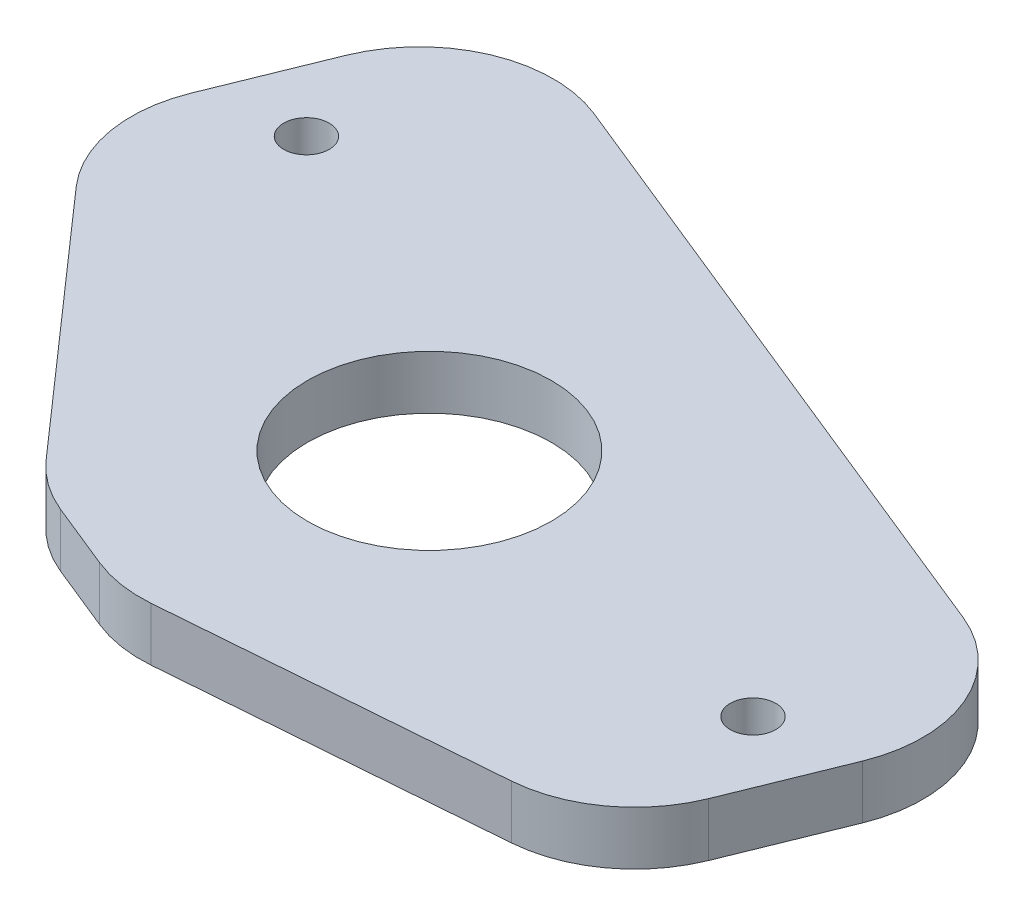
ISO-10303-21;
HEADER;
FILE_DESCRIPTION(('STEP AP214'),'2;1');
FILE_NAME('part.step','',(''),(''),'','','');
FILE_SCHEMA(('AUTOMOTIVE_DESIGN { 1 0 10303 214 1 1 1 1 }'));
ENDSEC;
DATA;
#1=APPLICATION_CONTEXT('core data for automotive mechanical design processes');
#2=APPLICATION_PROTOCOL_DEFINITION('international standard','automotive_design',2000,#1);
#3=PRODUCT_CONTEXT('',#1,'mechanical');
#4=PRODUCT('Part','Part','',(#3));
#5=PRODUCT_RELATED_PRODUCT_CATEGORY('part','',(#4));
#6=PRODUCT_DEFINITION_FORMATION('','',#4);
#7=PRODUCT_DEFINITION_CONTEXT('part definition',#1,'design');
#8=PRODUCT_DEFINITION('design','',#6,#7);
#9=PRODUCT_DEFINITION_SHAPE('','',#8);
#10=(LENGTH_UNIT() NAMED_UNIT(*) SI_UNIT(.MILLI.,.METRE.));
#11=(NAMED_UNIT(*) PLANE_ANGLE_UNIT() SI_UNIT($,.RADIAN.));
#12=(NAMED_UNIT(*) SI_UNIT($,.STERADIAN.) SOLID_ANGLE_UNIT());
#13=UNCERTAINTY_MEASURE_WITH_UNIT(LENGTH_MEASURE(1.E-05),#10,'distance_accuracy_value','');
#14=(GEOMETRIC_REPRESENTATION_CONTEXT(3) GLOBAL_UNCERTAINTY_ASSIGNED_CONTEXT((#13)) GLOBAL_UNIT_ASSIGNED_CONTEXT((#10,
#11,#12)) REPRESENTATION_CONTEXT('',''));
#15=CARTESIAN_POINT('',(0.,0.,0.));
#16=DIRECTION('',(0.,0.,1.));
#17=DIRECTION('',(1.,0.,0.));
#18=AXIS2_PLACEMENT_3D('',#15,#16,#17);
#19=CARTESIAN_POINT('',(0.,4.,0.));
#20=DIRECTION('',(0.,1.,0.));
#21=DIRECTION('',(0.,0.,1.));
#22=AXIS2_PLACEMENT_3D('',#19,#20,#21);
#23=PLANE('',#22);
#24=DIRECTION('',(0.375759041788815,0.,-0.926717401646236));
#25=VECTOR('',#24,1.);
#26=CARTESIAN_POINT('',(-141.27076053019,4.,-1.05980639931145));
#27=LINE('',#26,#25);
#28=CARTESIAN_POINT('',(-133.312056309301,4.,-20.6879959458386));
#29=VERTEX_POINT('',#28);
#30=CARTESIAN_POINT('',(-129.997989276525,4.,-28.8613284486986));
#31=VERTEX_POINT('',#30);
#32=EDGE_CURVE('E163',#29,#31,#27,.T.);
#33=ORIENTED_EDGE('',*,*,#32,.T.);
#34=CARTESIAN_POINT('',(-139.265163292987,4.,-32.6189188665867));
#35=DIRECTION('',(0.,1.,0.));
#36=DIRECTION('',(0.,0.,1.));
#37=AXIS2_PLACEMENT_3D('',#34,#35,#36);
#38=CIRCLE('',#37,10.);
#39=CARTESIAN_POINT('',(-135.507572875099,4.,-41.8860928830491));
#40=VERTEX_POINT('',#39);
#41=EDGE_CURVE('E184',#31,#40,#38,.T.);
#42=ORIENTED_EDGE('',*,*,#41,.T.);
#43=DIRECTION('',(-0.926717401646236,0.,-0.375759041788815));
#44=VECTOR('',#43,1.);
#45=CARTESIAN_POINT('',(-126.240398858637,4.,-38.1285024651609));
#46=LINE('',#45,#44);
#47=CARTESIAN_POINT('',(-181.843442957411,4.,-60.6740449724898));
#48=VERTEX_POINT('',#47);
#49=EDGE_CURVE('E144',#40,#48,#46,.T.);
#50=ORIENTED_EDGE('',*,*,#49,.T.);
#51=CARTESIAN_POINT('',(-185.601033375299,4.,-51.4068709560275));
#52=DIRECTION('',(0.,1.,0.));
#53=DIRECTION('',(0.,0.,1.));
#54=AXIS2_PLACEMENT_3D('',#51,#52,#53);
#55=CIRCLE('',#54,10.);
#56=CARTESIAN_POINT('',(-194.868207391762,4.,-55.1644613739156));
#57=VERTEX_POINT('',#56);
#58=EDGE_CURVE('E182',#48,#57,#55,.T.);
#59=ORIENTED_EDGE('',*,*,#58,.T.);
#60=DIRECTION('',(-0.375759041788815,0.,0.926717401646236));
#61=VECTOR('',#60,1.);
#62=CARTESIAN_POINT('',(-191.110616973873,4.,-64.431635390378));
#63=LINE('',#62,#61);
#64=CARTESIAN_POINT('',(-198.182274424538,4.,-46.9911288710557));
#65=VERTEX_POINT('',#64);
#66=EDGE_CURVE('E243',#57,#65,#63,.T.);
#67=ORIENTED_EDGE('',*,*,#66,.T.);
#68=CARTESIAN_POINT('',(-188.915100408076,4.,-43.2335384531675));
#69=DIRECTION('',(0.,1.,0.));
#70=DIRECTION('',(0.,0.,1.));
#71=AXIS2_PLACEMENT_3D('',#68,#69,#70);
#72=CIRCLE('',#71,10.);
#73=CARTESIAN_POINT('',(-196.420397662501,4.,-36.6251715503156));
#74=VERTEX_POINT('',#73);
#75=EDGE_CURVE('E180',#65,#74,#72,.T.);
#76=ORIENTED_EDGE('',*,*,#75,.T.);
#77=DIRECTION('',(-0.660836690285189,0.,-0.750529725442582));
#78=VECTOR('',#77,1.);
#79=CARTESIAN_POINT('',(-200.504593018594,4.,-41.263700349222));
#80=LINE('',#79,#78);
#81=CARTESIAN_POINT('',(-179.899480405372,4.,-17.8619284142511));
#82=VERTEX_POINT('',#81);
#83=EDGE_CURVE('E220',#82,#74,#80,.T.);
#84=ORIENTED_EDGE('',*,*,#83,.F.);
#85=CARTESIAN_POINT('',(-172.394183150946,4.,-24.470295317103));
#86=DIRECTION('',(0.,1.,0.));
#87=DIRECTION('',(0.,0.,1.));
#88=AXIS2_PLACEMENT_3D('',#85,#86,#87);
#89=CIRCLE('',#88,10.);
#90=CARTESIAN_POINT('',(-176.151773568834,4.,-15.2031213006406));
#91=VERTEX_POINT('',#90);
#92=EDGE_CURVE('E57',#82,#91,#89,.T.);
#93=ORIENTED_EDGE('',*,*,#92,.T.);
#94=DIRECTION('',(0.926717401646236,0.,0.375759041788815));
#95=VECTOR('',#94,1.);
#96=CARTESIAN_POINT('',(-206.140978645426,4.,-27.3629393245285));
#97=LINE('',#96,#95);
#98=CARTESIAN_POINT('',(-171.259965606781,4.,-13.2196244231994));
#99=VERTEX_POINT('',#98);
#100=EDGE_CURVE('E164',#91,#99,#97,.T.);
#101=ORIENTED_EDGE('',*,*,#100,.T.);
#102=CARTESIAN_POINT('',(-167.502375188893,4.,-22.4867984396617));
#103=DIRECTION('',(0.,1.,0.));
#104=DIRECTION('',(0.,0.,1.));
#105=AXIS2_PLACEMENT_3D('',#102,#103,#104);
#106=CIRCLE('',#105,10.);
#107=CARTESIAN_POINT('',(-166.718860019267,4.,-12.5175404944099));
#108=VERTEX_POINT('',#107);
#109=EDGE_CURVE('E49',#99,#108,#106,.T.);
#110=ORIENTED_EDGE('',*,*,#109,.T.);
#111=DIRECTION('',(-0.996925794525179,0.,0.078351516962602));
#112=VECTOR('',#111,1.);
#113=CARTESIAN_POINT('',(-135.634374903357,4.,-14.960567424005));
#114=LINE('',#113,#112);
#115=CARTESIAN_POINT('',(-141.795715156138,4.,-14.476328418475));
#116=VERTEX_POINT('',#115);
#117=EDGE_CURVE('E207',#116,#108,#114,.T.);
#118=ORIENTED_EDGE('',*,*,#117,.F.);
#119=CARTESIAN_POINT('',(-142.579230325764,4.,-24.4455863637268));
#120=DIRECTION('',(0.,1.,0.));
#121=DIRECTION('',(0.,0.,1.));
#122=AXIS2_PLACEMENT_3D('',#119,#120,#121);
#123=CIRCLE('',#122,10.);
#124=EDGE_CURVE('E176',#116,#29,#123,.T.);
#125=ORIENTED_EDGE('',*,*,#124,.T.);
#126=EDGE_LOOP('',(#33,#42,#50,#59,#67,#76,#84,#93,#101,#110,#118,#125));
#127=FACE_BOUND('',#126,.T.);
#128=CARTESIAN_POINT('',(-191.102800778534,4.,-48.4832324797371));
#129=DIRECTION('',(0.,1.,0.));
#130=DIRECTION('',(0.,0.,1.));
#131=AXIS2_PLACEMENT_3D('',#128,#129,#130);
#132=CIRCLE('',#131,1.70000000000001);
#133=CARTESIAN_POINT('',(-191.102800778534,4.,-46.7832324797371));
#134=VERTEX_POINT('',#133);
#135=EDGE_CURVE('E231',#134,#134,#132,.T.);
#136=ORIENTED_EDGE('',*,*,#135,.F.);
#137=EDGE_LOOP('',(#136));
#138=FACE_BOUND('',#137,.T.);
#139=CARTESIAN_POINT('',(-136.96169642471,4.,-27.6547344781782));
#140=DIRECTION('',(0.,1.,0.));
#141=DIRECTION('',(0.,0.,1.));
#142=AXIS2_PLACEMENT_3D('',#139,#140,#141);
#143=CIRCLE('',#142,1.69999999999998);
#144=CARTESIAN_POINT('',(-136.96169642471,4.,-25.9547344781782));
#145=VERTEX_POINT('',#144);
#146=EDGE_CURVE('E157',#145,#145,#143,.T.);
#147=ORIENTED_EDGE('',*,*,#146,.F.);
#148=EDGE_LOOP('',(#147));
#149=FACE_BOUND('',#148,.T.);
#150=CARTESIAN_POINT('',(-166.190688752031,4.,-32.7457208948447));
#151=DIRECTION('',(0.,1.,0.));
#152=DIRECTION('',(0.,0.,1.));
#153=AXIS2_PLACEMENT_3D('',#150,#151,#152);
#154=CIRCLE('',#153,9.1);
#155=CARTESIAN_POINT('',(-166.190688752031,4.,-23.6457208948447));
#156=VERTEX_POINT('',#155);
#157=EDGE_CURVE('E225',#156,#156,#154,.T.);
#158=ORIENTED_EDGE('',*,*,#157,.F.);
#159=EDGE_LOOP('',(#158));
#160=FACE_BOUND('',#159,.T.);
#161=ADVANCED_FACE('F34',(#127,#138,#149,#160),#23,.T.);
#162=CARTESIAN_POINT('',(0.,0.,0.));
#163=DIRECTION('',(0.,1.,0.));
#164=DIRECTION('',(0.,0.,1.));
#165=AXIS2_PLACEMENT_3D('',#162,#163,#164);
#166=PLANE('',#165);
#167=DIRECTION('',(-0.926717401646236,0.,-0.375759041788815));
#168=VECTOR('',#167,1.);
#169=CARTESIAN_POINT('',(-126.240398858637,0.,-38.1285024651609));
#170=LINE('',#169,#168);
#171=CARTESIAN_POINT('',(-135.507572875099,0.,-41.8860928830491));
#172=VERTEX_POINT('',#171);
#173=CARTESIAN_POINT('',(-181.843442957411,0.,-60.6740449724898));
#174=VERTEX_POINT('',#173);
#175=EDGE_CURVE('E141',#172,#174,#170,.T.);
#176=ORIENTED_EDGE('',*,*,#175,.F.);
#177=CARTESIAN_POINT('',(-139.265163292987,0.,-32.6189188665867));
#178=DIRECTION('',(0.,1.,0.));
#179=DIRECTION('',(0.,0.,1.));
#180=AXIS2_PLACEMENT_3D('',#177,#178,#179);
#181=CIRCLE('',#180,10.);
#182=CARTESIAN_POINT('',(-129.997989276525,0.,-28.8613284486986));
#183=VERTEX_POINT('',#182);
#184=EDGE_CURVE('E124',#172,#183,#181,.F.);
#185=ORIENTED_EDGE('',*,*,#184,.T.);
#186=DIRECTION('',(0.375759041788815,0.,-0.926717401646236));
#187=VECTOR('',#186,1.);
#188=CARTESIAN_POINT('',(-141.27076053019,0.,-1.05980639931145));
#189=LINE('',#188,#187);
#190=CARTESIAN_POINT('',(-133.312056309301,0.,-20.6879959458386));
#191=VERTEX_POINT('',#190);
#192=EDGE_CURVE('E152',#191,#183,#189,.T.);
#193=ORIENTED_EDGE('',*,*,#192,.F.);
#194=CARTESIAN_POINT('',(-142.579230325764,0.,-24.4455863637268));
#195=DIRECTION('',(0.,1.,0.));
#196=DIRECTION('',(0.,0.,1.));
#197=AXIS2_PLACEMENT_3D('',#194,#195,#196);
#198=CIRCLE('',#197,10.);
#199=CARTESIAN_POINT('',(-141.795715156138,0.,-14.476328418475));
#200=VERTEX_POINT('',#199);
#201=EDGE_CURVE('E145',#191,#200,#198,.F.);
#202=ORIENTED_EDGE('',*,*,#201,.T.);
#203=DIRECTION('',(-0.996925794525179,0.,0.078351516962602));
#204=VECTOR('',#203,1.);
#205=CARTESIAN_POINT('',(-135.634374903357,0.,-14.960567424005));
#206=LINE('',#205,#204);
#207=CARTESIAN_POINT('',(-166.718860019267,0.,-12.5175404944099));
#208=VERTEX_POINT('',#207);
#209=EDGE_CURVE('E209',#200,#208,#206,.T.);
#210=ORIENTED_EDGE('',*,*,#209,.T.);
#211=CARTESIAN_POINT('',(-167.502375188893,0.,-22.4867984396617));
#212=DIRECTION('',(0.,1.,0.));
#213=DIRECTION('',(0.,0.,1.));
#214=AXIS2_PLACEMENT_3D('',#211,#212,#213);
#215=CIRCLE('',#214,10.);
#216=CARTESIAN_POINT('',(-171.259965606781,0.,-13.2196244231994));
#217=VERTEX_POINT('',#216);
#218=EDGE_CURVE('E167',#208,#217,#215,.F.);
#219=ORIENTED_EDGE('',*,*,#218,.T.);
#220=DIRECTION('',(0.926717401646236,0.,0.375759041788815));
#221=VECTOR('',#220,1.);
#222=CARTESIAN_POINT('',(-206.140978645426,0.,-27.3629393245285));
#223=LINE('',#222,#221);
#224=CARTESIAN_POINT('',(-176.151773568834,0.,-15.2031213006406));
#225=VERTEX_POINT('',#224);
#226=EDGE_CURVE('E155',#225,#217,#223,.T.);
#227=ORIENTED_EDGE('',*,*,#226,.F.);
#228=CARTESIAN_POINT('',(-172.394183150946,0.,-24.470295317103));
#229=DIRECTION('',(0.,1.,0.));
#230=DIRECTION('',(0.,0.,1.));
#231=AXIS2_PLACEMENT_3D('',#228,#229,#230);
#232=CIRCLE('',#231,10.);
#233=CARTESIAN_POINT('',(-179.899480405372,0.,-17.8619284142511));
#234=VERTEX_POINT('',#233);
#235=EDGE_CURVE('E169',#225,#234,#232,.F.);
#236=ORIENTED_EDGE('',*,*,#235,.T.);
#237=DIRECTION('',(-0.660836690285189,0.,-0.750529725442582));
#238=VECTOR('',#237,1.);
#239=CARTESIAN_POINT('',(-200.504593018594,0.,-41.263700349222));
#240=LINE('',#239,#238);
#241=CARTESIAN_POINT('',(-196.420397662501,0.,-36.6251715503156));
#242=VERTEX_POINT('',#241);
#243=EDGE_CURVE('E215',#234,#242,#240,.T.);
#244=ORIENTED_EDGE('',*,*,#243,.T.);
#245=CARTESIAN_POINT('',(-188.915100408076,0.,-43.2335384531675));
#246=DIRECTION('',(0.,1.,0.));
#247=DIRECTION('',(0.,0.,1.));
#248=AXIS2_PLACEMENT_3D('',#245,#246,#247);
#249=CIRCLE('',#248,10.);
#250=CARTESIAN_POINT('',(-198.182274424538,0.,-46.9911288710557));
#251=VERTEX_POINT('',#250);
#252=EDGE_CURVE('E171',#242,#251,#249,.F.);
#253=ORIENTED_EDGE('',*,*,#252,.T.);
#254=DIRECTION('',(-0.375759041788815,0.,0.926717401646236));
#255=VECTOR('',#254,1.);
#256=CARTESIAN_POINT('',(-191.110616973873,0.,-64.431635390378));
#257=LINE('',#256,#255);
#258=CARTESIAN_POINT('',(-194.868207391762,0.,-55.1644613739156));
#259=VERTEX_POINT('',#258);
#260=EDGE_CURVE('E151',#259,#251,#257,.T.);
#261=ORIENTED_EDGE('',*,*,#260,.F.);
#262=CARTESIAN_POINT('',(-185.601033375299,0.,-51.4068709560275));
#263=DIRECTION('',(0.,1.,0.));
#264=DIRECTION('',(0.,0.,1.));
#265=AXIS2_PLACEMENT_3D('',#262,#263,#264);
#266=CIRCLE('',#265,10.);
#267=EDGE_CURVE('E135',#259,#174,#266,.F.);
#268=ORIENTED_EDGE('',*,*,#267,.T.);
#269=EDGE_LOOP('',(#176,#185,#193,#202,#210,#219,#227,#236,#244,#253,#261,#268));
#270=FACE_BOUND('',#269,.T.);
#271=CARTESIAN_POINT('',(-136.96169642471,0.,-27.6547344781782));
#272=DIRECTION('',(0.,1.,0.));
#273=DIRECTION('',(0.,0.,1.));
#274=AXIS2_PLACEMENT_3D('',#271,#272,#273);
#275=CIRCLE('',#274,1.69999999999998);
#276=CARTESIAN_POINT('',(-136.96169642471,0.,-25.9547344781782));
#277=VERTEX_POINT('',#276);
#278=EDGE_CURVE('E234',#277,#277,#275,.T.);
#279=ORIENTED_EDGE('',*,*,#278,.T.);
#280=EDGE_LOOP('',(#279));
#281=FACE_BOUND('',#280,.T.);
#282=CARTESIAN_POINT('',(-191.102800778534,0.,-48.4832324797371));
#283=DIRECTION('',(0.,1.,0.));
#284=DIRECTION('',(0.,0.,1.));
#285=AXIS2_PLACEMENT_3D('',#282,#283,#284);
#286=CIRCLE('',#285,1.70000000000001);
#287=CARTESIAN_POINT('',(-191.102800778534,0.,-46.7832324797371));
#288=VERTEX_POINT('',#287);
#289=EDGE_CURVE('E228',#288,#288,#286,.T.);
#290=ORIENTED_EDGE('',*,*,#289,.T.);
#291=EDGE_LOOP('',(#290));
#292=FACE_BOUND('',#291,.T.);
#293=CARTESIAN_POINT('',(-166.190688752031,0.,-32.7457208948447));
#294=DIRECTION('',(0.,1.,0.));
#295=DIRECTION('',(0.,0.,1.));
#296=AXIS2_PLACEMENT_3D('',#293,#294,#295);
#297=CIRCLE('',#296,9.1);
#298=CARTESIAN_POINT('',(-166.190688752031,0.,-23.6457208948447));
#299=VERTEX_POINT('',#298);
#300=EDGE_CURVE('E217',#299,#299,#297,.T.);
#301=ORIENTED_EDGE('',*,*,#300,.T.);
#302=EDGE_LOOP('',(#301));
#303=FACE_BOUND('',#302,.T.);
#304=ADVANCED_FACE('F148',(#270,#281,#292,#303),#166,.F.);
#305=CARTESIAN_POINT('',(-141.27076053019,4.,-1.05980639931145));
#306=DIRECTION('',(-0.926717401646236,0.,-0.375759041788815));
#307=DIRECTION('',(-0.375759041788815,0.,0.926717401646236));
#308=AXIS2_PLACEMENT_3D('',#305,#306,#307);
#309=PLANE('',#308);
#310=ORIENTED_EDGE('',*,*,#192,.T.);
#311=DIRECTION('',(0.,-1.,0.));
#312=VECTOR('',#311,1.);
#313=CARTESIAN_POINT('',(-129.997989276525,4.,-28.8613284486986));
#314=LINE('',#313,#312);
#315=EDGE_CURVE('E129',#183,#31,#314,.F.);
#316=ORIENTED_EDGE('',*,*,#315,.T.);
#317=ORIENTED_EDGE('',*,*,#32,.F.);
#318=DIRECTION('',(0.,1.,0.));
#319=VECTOR('',#318,1.);
#320=CARTESIAN_POINT('',(-133.312056309301,4.,-20.6879959458386));
#321=LINE('',#320,#319);
#322=EDGE_CURVE('E134',#29,#191,#321,.F.);
#323=ORIENTED_EDGE('',*,*,#322,.T.);
#324=EDGE_LOOP('',(#310,#316,#317,#323));
#325=FACE_BOUND('',#324,.T.);
#326=ADVANCED_FACE('F270',(#325),#309,.F.);
#327=CARTESIAN_POINT('',(-126.240398858637,4.,-38.1285024651609));
#328=DIRECTION('',(-0.375759041788815,0.,0.926717401646236));
#329=DIRECTION('',(0.926717401646236,0.,0.375759041788815));
#330=AXIS2_PLACEMENT_3D('',#327,#328,#329);
#331=PLANE('',#330);
#332=ORIENTED_EDGE('',*,*,#49,.F.);
#333=DIRECTION('',(0.,-1.,0.));
#334=VECTOR('',#333,1.);
#335=CARTESIAN_POINT('',(-135.507572875099,4.,-41.8860928830491));
#336=LINE('',#335,#334);
#337=EDGE_CURVE('E128',#40,#172,#336,.T.);
#338=ORIENTED_EDGE('',*,*,#337,.T.);
#339=ORIENTED_EDGE('',*,*,#175,.T.);
#340=DIRECTION('',(0.,-1.,0.));
#341=VECTOR('',#340,1.);
#342=CARTESIAN_POINT('',(-181.843442957411,4.,-60.6740449724898));
#343=LINE('',#342,#341);
#344=EDGE_CURVE('E146',#174,#48,#343,.F.);
#345=ORIENTED_EDGE('',*,*,#344,.T.);
#346=EDGE_LOOP('',(#332,#338,#339,#345));
#347=FACE_BOUND('',#346,.T.);
#348=ADVANCED_FACE('F140',(#347),#331,.F.);
#349=CARTESIAN_POINT('',(-191.110616973873,4.,-64.431635390378));
#350=DIRECTION('',(0.926717401646236,0.,0.375759041788815));
#351=DIRECTION('',(0.375759041788815,0.,-0.926717401646236));
#352=AXIS2_PLACEMENT_3D('',#349,#350,#351);
#353=PLANE('',#352);
#354=ORIENTED_EDGE('',*,*,#66,.F.);
#355=DIRECTION('',(0.,-1.,0.));
#356=VECTOR('',#355,1.);
#357=CARTESIAN_POINT('',(-194.868207391762,4.,-55.1644613739156));
#358=LINE('',#357,#356);
#359=EDGE_CURVE('E189',#57,#259,#358,.T.);
#360=ORIENTED_EDGE('',*,*,#359,.T.);
#361=ORIENTED_EDGE('',*,*,#260,.T.);
#362=DIRECTION('',(0.,1.,0.));
#363=VECTOR('',#362,1.);
#364=CARTESIAN_POINT('',(-198.182274424538,4.,-46.9911288710557));
#365=LINE('',#364,#363);
#366=EDGE_CURVE('E186',#251,#65,#365,.T.);
#367=ORIENTED_EDGE('',*,*,#366,.T.);
#368=EDGE_LOOP('',(#354,#360,#361,#367));
#369=FACE_BOUND('',#368,.T.);
#370=ADVANCED_FACE('F263',(#369),#353,.F.);
#371=CARTESIAN_POINT('',(-206.140978645426,4.,-27.3629393245285));
#372=DIRECTION('',(0.375759041788815,0.,-0.926717401646236));
#373=DIRECTION('',(-0.926717401646236,0.,-0.375759041788815));
#374=AXIS2_PLACEMENT_3D('',#371,#372,#373);
#375=PLANE('',#374);
#376=ORIENTED_EDGE('',*,*,#100,.F.);
#377=DIRECTION('',(0.,1.,0.));
#378=VECTOR('',#377,1.);
#379=CARTESIAN_POINT('',(-176.151773568834,4.,-15.2031213006406));
#380=LINE('',#379,#378);
#381=EDGE_CURVE('E199',#91,#225,#380,.F.);
#382=ORIENTED_EDGE('',*,*,#381,.T.);
#383=ORIENTED_EDGE('',*,*,#226,.T.);
#384=DIRECTION('',(0.,1.,0.));
#385=VECTOR('',#384,1.);
#386=CARTESIAN_POINT('',(-171.259965606781,4.,-13.2196244231994));
#387=LINE('',#386,#385);
#388=EDGE_CURVE('E197',#217,#99,#387,.T.);
#389=ORIENTED_EDGE('',*,*,#388,.T.);
#390=EDGE_LOOP('',(#376,#382,#383,#389));
#391=FACE_BOUND('',#390,.T.);
#392=ADVANCED_FACE('F247',(#391),#375,.F.);
#393=CARTESIAN_POINT('',(-136.96169642471,4.,-27.6547344781782));
#394=DIRECTION('',(0.,-1.,0.));
#395=DIRECTION('',(0.,0.,-1.));
#396=AXIS2_PLACEMENT_3D('',#393,#394,#395);
#397=CYLINDRICAL_SURFACE('',#396,1.69999999999998);
#398=ORIENTED_EDGE('',*,*,#146,.T.);
#399=EDGE_LOOP('',(#398));
#400=FACE_BOUND('',#399,.T.);
#401=ORIENTED_EDGE('',*,*,#278,.F.);
#402=EDGE_LOOP('',(#401));
#403=FACE_BOUND('',#402,.T.);
#404=ADVANCED_FACE('F286',(#400,#403),#397,.F.);
#405=CARTESIAN_POINT('',(-191.102800778534,4.,-48.4832324797371));
#406=DIRECTION('',(0.,-1.,0.));
#407=DIRECTION('',(0.,0.,-1.));
#408=AXIS2_PLACEMENT_3D('',#405,#406,#407);
#409=CYLINDRICAL_SURFACE('',#408,1.70000000000001);
#410=ORIENTED_EDGE('',*,*,#135,.T.);
#411=EDGE_LOOP('',(#410));
#412=FACE_BOUND('',#411,.T.);
#413=ORIENTED_EDGE('',*,*,#289,.F.);
#414=EDGE_LOOP('',(#413));
#415=FACE_BOUND('',#414,.T.);
#416=ADVANCED_FACE('F357',(#412,#415),#409,.F.);
#417=CARTESIAN_POINT('',(-166.190688752031,4.,-32.7457208948447));
#418=DIRECTION('',(0.,-1.,0.));
#419=DIRECTION('',(0.,0.,-1.));
#420=AXIS2_PLACEMENT_3D('',#417,#418,#419);
#421=CYLINDRICAL_SURFACE('',#420,9.1);
#422=ORIENTED_EDGE('',*,*,#157,.T.);
#423=EDGE_LOOP('',(#422));
#424=FACE_BOUND('',#423,.T.);
#425=ORIENTED_EDGE('',*,*,#300,.F.);
#426=EDGE_LOOP('',(#425));
#427=FACE_BOUND('',#426,.T.);
#428=ADVANCED_FACE('F348',(#424,#427),#421,.F.);
#429=CARTESIAN_POINT('',(-200.504593018594,0.,-41.263700349222));
#430=DIRECTION('',(0.750529725442582,0.,-0.660836690285189));
#431=DIRECTION('',(-0.660836690285189,0.,-0.750529725442582));
#432=AXIS2_PLACEMENT_3D('',#429,#430,#431);
#433=PLANE('',#432);
#434=ORIENTED_EDGE('',*,*,#83,.T.);
#435=DIRECTION('',(0.,1.,0.));
#436=VECTOR('',#435,1.);
#437=CARTESIAN_POINT('',(-196.420397662501,0.,-36.6251715503156));
#438=LINE('',#437,#436);
#439=EDGE_CURVE('E195',#74,#242,#438,.F.);
#440=ORIENTED_EDGE('',*,*,#439,.T.);
#441=ORIENTED_EDGE('',*,*,#243,.F.);
#442=DIRECTION('',(0.,1.,0.));
#443=VECTOR('',#442,1.);
#444=CARTESIAN_POINT('',(-179.899480405372,0.,-17.8619284142511));
#445=LINE('',#444,#443);
#446=EDGE_CURVE('E192',#234,#82,#445,.T.);
#447=ORIENTED_EDGE('',*,*,#446,.T.);
#448=EDGE_LOOP('',(#434,#440,#441,#447));
#449=FACE_BOUND('',#448,.T.);
#450=ADVANCED_FACE('F256',(#449),#433,.F.);
#451=CARTESIAN_POINT('',(-135.634374903357,0.,-14.960567424005));
#452=DIRECTION('',(-0.078351516962602,0.,-0.996925794525179));
#453=DIRECTION('',(-0.996925794525179,0.,0.078351516962602));
#454=AXIS2_PLACEMENT_3D('',#451,#452,#453);
#455=PLANE('',#454);
#456=ORIENTED_EDGE('',*,*,#117,.T.);
#457=DIRECTION('',(0.,1.,0.));
#458=VECTOR('',#457,1.);
#459=CARTESIAN_POINT('',(-166.718860019267,0.,-12.5175404944099));
#460=LINE('',#459,#458);
#461=EDGE_CURVE('E11',#108,#208,#460,.F.);
#462=ORIENTED_EDGE('',*,*,#461,.T.);
#463=ORIENTED_EDGE('',*,*,#209,.F.);
#464=DIRECTION('',(0.,1.,0.));
#465=VECTOR('',#464,1.);
#466=CARTESIAN_POINT('',(-141.795715156138,0.,-14.476328418475));
#467=LINE('',#466,#465);
#468=EDGE_CURVE('E42',#200,#116,#467,.T.);
#469=ORIENTED_EDGE('',*,*,#468,.T.);
#470=EDGE_LOOP('',(#456,#462,#463,#469));
#471=FACE_BOUND('',#470,.T.);
#472=ADVANCED_FACE('F206',(#471),#455,.F.);
#473=CARTESIAN_POINT('',(-139.265163292987,4.,-32.6189188665867));
#474=DIRECTION('',(0.,-1.,0.));
#475=DIRECTION('',(0.,0.,-1.));
#476=AXIS2_PLACEMENT_3D('',#473,#474,#475);
#477=CYLINDRICAL_SURFACE('',#476,10.);
#478=ORIENTED_EDGE('',*,*,#41,.F.);
#479=ORIENTED_EDGE('',*,*,#315,.F.);
#480=ORIENTED_EDGE('',*,*,#184,.F.);
#481=ORIENTED_EDGE('',*,*,#337,.F.);
#482=EDGE_LOOP('',(#478,#479,#480,#481));
#483=FACE_BOUND('',#482,.T.);
#484=ADVANCED_FACE('F127',(#483),#477,.T.);
#485=CARTESIAN_POINT('',(-185.601033375299,4.,-51.4068709560275));
#486=DIRECTION('',(0.,-1.,0.));
#487=DIRECTION('',(0.,0.,-1.));
#488=AXIS2_PLACEMENT_3D('',#485,#486,#487);
#489=CYLINDRICAL_SURFACE('',#488,10.);
#490=ORIENTED_EDGE('',*,*,#58,.F.);
#491=ORIENTED_EDGE('',*,*,#344,.F.);
#492=ORIENTED_EDGE('',*,*,#267,.F.);
#493=ORIENTED_EDGE('',*,*,#359,.F.);
#494=EDGE_LOOP('',(#490,#491,#492,#493));
#495=FACE_BOUND('',#494,.T.);
#496=ADVANCED_FACE('F267',(#495),#489,.T.);
#497=CARTESIAN_POINT('',(-188.915100408076,4.,-43.2335384531675));
#498=DIRECTION('',(0.,1.,0.));
#499=DIRECTION('',(0.,0.,1.));
#500=AXIS2_PLACEMENT_3D('',#497,#498,#499);
#501=CYLINDRICAL_SURFACE('',#500,10.);
#502=ORIENTED_EDGE('',*,*,#252,.F.);
#503=ORIENTED_EDGE('',*,*,#439,.F.);
#504=ORIENTED_EDGE('',*,*,#75,.F.);
#505=ORIENTED_EDGE('',*,*,#366,.F.);
#506=EDGE_LOOP('',(#502,#503,#504,#505));
#507=FACE_BOUND('',#506,.T.);
#508=ADVANCED_FACE('F259',(#507),#501,.T.);
#509=CARTESIAN_POINT('',(-172.394183150946,0.,-24.470295317103));
#510=DIRECTION('',(0.,1.,0.));
#511=DIRECTION('',(0.,0.,1.));
#512=AXIS2_PLACEMENT_3D('',#509,#510,#511);
#513=CYLINDRICAL_SURFACE('',#512,10.);
#514=ORIENTED_EDGE('',*,*,#235,.F.);
#515=ORIENTED_EDGE('',*,*,#381,.F.);
#516=ORIENTED_EDGE('',*,*,#92,.F.);
#517=ORIENTED_EDGE('',*,*,#446,.F.);
#518=EDGE_LOOP('',(#514,#515,#516,#517));
#519=FACE_BOUND('',#518,.T.);
#520=ADVANCED_FACE('F251',(#519),#513,.T.);
#521=CARTESIAN_POINT('',(-167.502375188893,4.,-22.4867984396617));
#522=DIRECTION('',(0.,1.,0.));
#523=DIRECTION('',(0.,0.,1.));
#524=AXIS2_PLACEMENT_3D('',#521,#522,#523);
#525=CYLINDRICAL_SURFACE('',#524,10.);
#526=ORIENTED_EDGE('',*,*,#218,.F.);
#527=ORIENTED_EDGE('',*,*,#461,.F.);
#528=ORIENTED_EDGE('',*,*,#109,.F.);
#529=ORIENTED_EDGE('',*,*,#388,.F.);
#530=EDGE_LOOP('',(#526,#527,#528,#529));
#531=FACE_BOUND('',#530,.T.);
#532=ADVANCED_FACE('F272',(#531),#525,.T.);
#533=CARTESIAN_POINT('',(-142.579230325764,0.,-24.4455863637268));
#534=DIRECTION('',(0.,1.,0.));
#535=DIRECTION('',(0.,0.,1.));
#536=AXIS2_PLACEMENT_3D('',#533,#534,#535);
#537=CYLINDRICAL_SURFACE('',#536,10.);
#538=ORIENTED_EDGE('',*,*,#201,.F.);
#539=ORIENTED_EDGE('',*,*,#322,.F.);
#540=ORIENTED_EDGE('',*,*,#124,.F.);
#541=ORIENTED_EDGE('',*,*,#468,.F.);
#542=EDGE_LOOP('',(#538,#539,#540,#541));
#543=FACE_BOUND('',#542,.T.);
#544=ADVANCED_FACE('F36',(#543),#537,.T.);
#545=CLOSED_SHELL('',(#161,#304,#326,#348,#370,#392,#404,#416,#428,#450,#472,#484,#496,#508,
#520,#532,#544));
#546=MANIFOLD_SOLID_BREP('B2',#545);
#547=ADVANCED_BREP_SHAPE_REPRESENTATION('',(#18,#546),#14);
#548=SHAPE_DEFINITION_REPRESENTATION(#9,#547);
ENDSEC;
END-ISO-10303-21;
